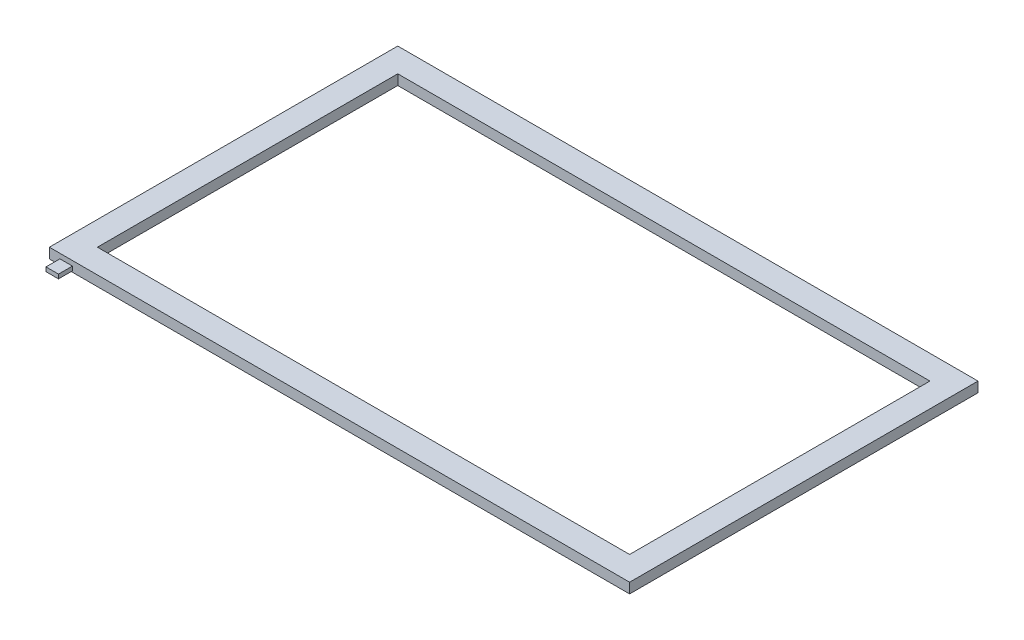
ISO-10303-21;
HEADER;
FILE_DESCRIPTION(('STEP AP214'),'2;1');
FILE_NAME('part.step','',(''),(''),'','','');
FILE_SCHEMA(('AUTOMOTIVE_DESIGN { 1 0 10303 214 1 1 1 1 }'));
ENDSEC;
DATA;
#1=APPLICATION_CONTEXT('core data for automotive mechanical design processes');
#2=APPLICATION_PROTOCOL_DEFINITION('international standard','automotive_design',2000,#1);
#3=PRODUCT_CONTEXT('',#1,'mechanical');
#4=PRODUCT('Part','Part','',(#3));
#5=PRODUCT_RELATED_PRODUCT_CATEGORY('part','',(#4));
#6=PRODUCT_DEFINITION_FORMATION('','',#4);
#7=PRODUCT_DEFINITION_CONTEXT('part definition',#1,'design');
#8=PRODUCT_DEFINITION('design','',#6,#7);
#9=PRODUCT_DEFINITION_SHAPE('','',#8);
#10=(LENGTH_UNIT() NAMED_UNIT(*) SI_UNIT(.MILLI.,.METRE.));
#11=(NAMED_UNIT(*) PLANE_ANGLE_UNIT() SI_UNIT($,.RADIAN.));
#12=(NAMED_UNIT(*) SI_UNIT($,.STERADIAN.) SOLID_ANGLE_UNIT());
#13=UNCERTAINTY_MEASURE_WITH_UNIT(LENGTH_MEASURE(1.E-05),#10,'distance_accuracy_value','');
#14=(GEOMETRIC_REPRESENTATION_CONTEXT(3) GLOBAL_UNCERTAINTY_ASSIGNED_CONTEXT((#13)) GLOBAL_UNIT_ASSIGNED_CONTEXT((#10,
#11,#12)) REPRESENTATION_CONTEXT('',''));
#15=CARTESIAN_POINT('',(0.,0.,0.));
#16=DIRECTION('',(0.,0.,1.));
#17=DIRECTION('',(1.,0.,0.));
#18=AXIS2_PLACEMENT_3D('',#15,#16,#17);
#19=CARTESIAN_POINT('',(383.38125,10.7950000000027,230.1875));
#20=DIRECTION('',(0.,0.,-1.));
#21=DIRECTION('',(1.,0.,0.));
#22=AXIS2_PLACEMENT_3D('',#19,#20,#21);
#23=PLANE('',#22);
#24=DIRECTION('',(-1.,0.,0.));
#25=VECTOR('',#24,1.);
#26=CARTESIAN_POINT('',(383.38125,24.2570000000027,230.1875));
#27=LINE('',#26,#25);
#28=CARTESIAN_POINT('',(383.38125,24.2570000000027,230.1875));
#29=VERTEX_POINT('',#28);
#30=CARTESIAN_POINT('',(-383.38125,24.2569999999973,230.1875));
#31=VERTEX_POINT('',#30);
#32=EDGE_CURVE('E185',#29,#31,#27,.T.);
#33=ORIENTED_EDGE('',*,*,#32,.T.);
#34=DIRECTION('',(0.,1.,0.));
#35=VECTOR('',#34,1.);
#36=CARTESIAN_POINT('',(-383.38125,10.7949999999973,230.1875));
#37=LINE('',#36,#35);
#38=CARTESIAN_POINT('',(-383.38125,10.7949999999973,230.1875));
#39=VERTEX_POINT('',#38);
#40=EDGE_CURVE('E191',#39,#31,#37,.T.);
#41=ORIENTED_EDGE('',*,*,#40,.F.);
#42=DIRECTION('',(-1.,0.,0.));
#43=VECTOR('',#42,1.);
#44=CARTESIAN_POINT('',(383.38125,10.7950000000027,230.1875));
#45=LINE('',#44,#43);
#46=CARTESIAN_POINT('',(383.38125,10.7950000000027,230.1875));
#47=VERTEX_POINT('',#46);
#48=EDGE_CURVE('E189',#47,#39,#45,.T.);
#49=ORIENTED_EDGE('',*,*,#48,.F.);
#50=DIRECTION('',(0.,1.,0.));
#51=VECTOR('',#50,1.);
#52=CARTESIAN_POINT('',(383.38125,10.7950000000027,230.1875));
#53=LINE('',#52,#51);
#54=EDGE_CURVE('E201',#47,#29,#53,.T.);
#55=ORIENTED_EDGE('',*,*,#54,.T.);
#56=EDGE_LOOP('',(#33,#41,#49,#55));
#57=FACE_BOUND('',#56,.T.);
#58=DIRECTION('',(0.,-1.,0.));
#59=VECTOR('',#58,1.);
#60=CARTESIAN_POINT('',(-369.41125,17.9069999999974,230.1875));
#61=LINE('',#60,#59);
#62=CARTESIAN_POINT('',(-369.41125,17.9069999999974,230.1875));
#63=VERTEX_POINT('',#62);
#64=CARTESIAN_POINT('',(-369.41125,12.3951999999974,230.1875));
#65=VERTEX_POINT('',#64);
#66=EDGE_CURVE('E142',#63,#65,#61,.T.);
#67=ORIENTED_EDGE('',*,*,#66,.F.);
#68=DIRECTION('',(-1.,0.,0.));
#69=VECTOR('',#68,1.);
#70=CARTESIAN_POINT('',(-369.41125,17.9069999999974,230.1875));
#71=LINE('',#70,#69);
#72=CARTESIAN_POINT('',(-352.90125,17.9069999999974,230.1875));
#73=VERTEX_POINT('',#72);
#74=EDGE_CURVE('E139',#73,#63,#71,.T.);
#75=ORIENTED_EDGE('',*,*,#74,.F.);
#76=DIRECTION('',(0.,1.,0.));
#77=VECTOR('',#76,1.);
#78=CARTESIAN_POINT('',(-352.90125,17.9069999999974,230.1875));
#79=LINE('',#78,#77);
#80=CARTESIAN_POINT('',(-352.90125,12.3951999999974,230.1875));
#81=VERTEX_POINT('',#80);
#82=EDGE_CURVE('E53',#81,#73,#79,.T.);
#83=ORIENTED_EDGE('',*,*,#82,.F.);
#84=DIRECTION('',(1.,0.,0.));
#85=VECTOR('',#84,1.);
#86=CARTESIAN_POINT('',(-369.41125,12.3951999999974,230.1875));
#87=LINE('',#86,#85);
#88=EDGE_CURVE('E48',#65,#81,#87,.T.);
#89=ORIENTED_EDGE('',*,*,#88,.F.);
#90=EDGE_LOOP('',(#67,#75,#83,#89));
#91=FACE_BOUND('',#90,.T.);
#92=ADVANCED_FACE('F33',(#57,#91),#23,.F.);
#93=CARTESIAN_POINT('',(-383.38125,10.7949999999973,230.1875));
#94=DIRECTION('',(1.,0.,0.));
#95=DIRECTION('',(0.,0.,1.));
#96=AXIS2_PLACEMENT_3D('',#93,#94,#95);
#97=PLANE('',#96);
#98=DIRECTION('',(0.,0.,-1.));
#99=VECTOR('',#98,1.);
#100=CARTESIAN_POINT('',(-383.38125,24.2569999999973,230.1875));
#101=LINE('',#100,#99);
#102=CARTESIAN_POINT('',(-383.38125,24.2569999999973,-230.1875));
#103=VERTEX_POINT('',#102);
#104=EDGE_CURVE('E174',#31,#103,#101,.T.);
#105=ORIENTED_EDGE('',*,*,#104,.T.);
#106=DIRECTION('',(0.,1.,0.));
#107=VECTOR('',#106,1.);
#108=CARTESIAN_POINT('',(-383.38125,10.7949999999973,-230.1875));
#109=LINE('',#108,#107);
#110=CARTESIAN_POINT('',(-383.38125,10.7949999999973,-230.1875));
#111=VERTEX_POINT('',#110);
#112=EDGE_CURVE('E11',#111,#103,#109,.T.);
#113=ORIENTED_EDGE('',*,*,#112,.F.);
#114=DIRECTION('',(0.,0.,-1.));
#115=VECTOR('',#114,1.);
#116=CARTESIAN_POINT('',(-383.38125,10.7949999999973,230.1875));
#117=LINE('',#116,#115);
#118=EDGE_CURVE('E181',#39,#111,#117,.T.);
#119=ORIENTED_EDGE('',*,*,#118,.F.);
#120=ORIENTED_EDGE('',*,*,#40,.T.);
#121=EDGE_LOOP('',(#105,#113,#119,#120));
#122=FACE_BOUND('',#121,.T.);
#123=ADVANCED_FACE('F35',(#122),#97,.F.);
#124=CARTESIAN_POINT('',(383.38125,10.7950000000027,-230.1875));
#125=DIRECTION('',(0.,0.,1.));
#126=DIRECTION('',(-1.,0.,0.));
#127=AXIS2_PLACEMENT_3D('',#124,#125,#126);
#128=PLANE('',#127);
#129=DIRECTION('',(1.,0.,0.));
#130=VECTOR('',#129,1.);
#131=CARTESIAN_POINT('',(383.38125,24.2570000000027,-230.1875));
#132=LINE('',#131,#130);
#133=CARTESIAN_POINT('',(383.38125,24.2570000000027,-230.1875));
#134=VERTEX_POINT('',#133);
#135=EDGE_CURVE('E194',#103,#134,#132,.T.);
#136=ORIENTED_EDGE('',*,*,#135,.T.);
#137=DIRECTION('',(0.,1.,0.));
#138=VECTOR('',#137,1.);
#139=CARTESIAN_POINT('',(383.38125,10.7950000000027,-230.1875));
#140=LINE('',#139,#138);
#141=CARTESIAN_POINT('',(383.38125,10.7950000000027,-230.1875));
#142=VERTEX_POINT('',#141);
#143=EDGE_CURVE('E41',#142,#134,#140,.T.);
#144=ORIENTED_EDGE('',*,*,#143,.F.);
#145=DIRECTION('',(1.,0.,0.));
#146=VECTOR('',#145,1.);
#147=CARTESIAN_POINT('',(383.38125,10.7950000000027,-230.1875));
#148=LINE('',#147,#146);
#149=EDGE_CURVE('E184',#111,#142,#148,.T.);
#150=ORIENTED_EDGE('',*,*,#149,.F.);
#151=ORIENTED_EDGE('',*,*,#112,.T.);
#152=EDGE_LOOP('',(#136,#144,#150,#151));
#153=FACE_BOUND('',#152,.T.);
#154=ADVANCED_FACE('F223',(#153),#128,.F.);
#155=CARTESIAN_POINT('',(383.38125,10.7950000000027,230.1875));
#156=DIRECTION('',(-1.,0.,0.));
#157=DIRECTION('',(0.,0.,-1.));
#158=AXIS2_PLACEMENT_3D('',#155,#156,#157);
#159=PLANE('',#158);
#160=DIRECTION('',(0.,0.,1.));
#161=VECTOR('',#160,1.);
#162=CARTESIAN_POINT('',(383.38125,24.2570000000027,230.1875));
#163=LINE('',#162,#161);
#164=EDGE_CURVE('E196',#134,#29,#163,.T.);
#165=ORIENTED_EDGE('',*,*,#164,.T.);
#166=ORIENTED_EDGE('',*,*,#54,.F.);
#167=DIRECTION('',(0.,0.,1.));
#168=VECTOR('',#167,1.);
#169=CARTESIAN_POINT('',(383.38125,10.7950000000027,230.1875));
#170=LINE('',#169,#168);
#171=EDGE_CURVE('E187',#142,#47,#170,.T.);
#172=ORIENTED_EDGE('',*,*,#171,.F.);
#173=ORIENTED_EDGE('',*,*,#143,.T.);
#174=EDGE_LOOP('',(#165,#166,#172,#173));
#175=FACE_BOUND('',#174,.T.);
#176=ADVANCED_FACE('F208',(#175),#159,.F.);
#177=CARTESIAN_POINT('',(2.63390369239648E-13,10.795,0.));
#178=DIRECTION('',(0.,1.,0.));
#179=DIRECTION('',(0.,0.,-1.));
#180=AXIS2_PLACEMENT_3D('',#177,#178,#179);
#181=PLANE('',#180);
#182=DIRECTION('',(1.,0.,0.));
#183=VECTOR('',#182,1.);
#184=CARTESIAN_POINT('',(351.63125,10.7950000000025,-198.4375));
#185=LINE('',#184,#183);
#186=CARTESIAN_POINT('',(-351.63125,10.7949999999975,-198.4375));
#187=VERTEX_POINT('',#186);
#188=CARTESIAN_POINT('',(351.63125,10.7950000000025,-198.4375));
#189=VERTEX_POINT('',#188);
#190=EDGE_CURVE('E145',#187,#189,#185,.T.);
#191=ORIENTED_EDGE('',*,*,#190,.F.);
#192=DIRECTION('',(0.,0.,-1.));
#193=VECTOR('',#192,1.);
#194=CARTESIAN_POINT('',(-351.63125,10.7949999999975,198.4375));
#195=LINE('',#194,#193);
#196=CARTESIAN_POINT('',(-351.63125,10.7949999999975,198.4375));
#197=VERTEX_POINT('',#196);
#198=EDGE_CURVE('E143',#197,#187,#195,.T.);
#199=ORIENTED_EDGE('',*,*,#198,.F.);
#200=DIRECTION('',(-1.,0.,0.));
#201=VECTOR('',#200,1.);
#202=CARTESIAN_POINT('',(351.63125,10.7950000000025,198.4375));
#203=LINE('',#202,#201);
#204=CARTESIAN_POINT('',(351.63125,10.7950000000025,198.4375));
#205=VERTEX_POINT('',#204);
#206=EDGE_CURVE('E155',#205,#197,#203,.T.);
#207=ORIENTED_EDGE('',*,*,#206,.F.);
#208=DIRECTION('',(0.,0.,1.));
#209=VECTOR('',#208,1.);
#210=CARTESIAN_POINT('',(351.63125,10.7950000000025,198.4375));
#211=LINE('',#210,#209);
#212=EDGE_CURVE('E167',#189,#205,#211,.T.);
#213=ORIENTED_EDGE('',*,*,#212,.F.);
#214=EDGE_LOOP('',(#191,#199,#207,#213));
#215=FACE_BOUND('',#214,.T.);
#216=ORIENTED_EDGE('',*,*,#118,.T.);
#217=ORIENTED_EDGE('',*,*,#149,.T.);
#218=ORIENTED_EDGE('',*,*,#171,.T.);
#219=ORIENTED_EDGE('',*,*,#48,.T.);
#220=EDGE_LOOP('',(#216,#217,#218,#219));
#221=FACE_BOUND('',#220,.T.);
#222=ADVANCED_FACE('F222',(#215,#221),#181,.F.);
#223=CARTESIAN_POINT('',(1.69385725672636E-13,24.257,0.));
#224=DIRECTION('',(0.,1.,0.));
#225=DIRECTION('',(0.,0.,-1.));
#226=AXIS2_PLACEMENT_3D('',#223,#224,#225);
#227=PLANE('',#226);
#228=DIRECTION('',(0.,0.,-1.));
#229=VECTOR('',#228,1.);
#230=CARTESIAN_POINT('',(-351.63125,24.2569999999975,198.4375));
#231=LINE('',#230,#229);
#232=CARTESIAN_POINT('',(-351.63125,24.2569999999975,198.4375));
#233=VERTEX_POINT('',#232);
#234=CARTESIAN_POINT('',(-351.63125,24.2569999999975,-198.4375));
#235=VERTEX_POINT('',#234);
#236=EDGE_CURVE('E151',#233,#235,#231,.T.);
#237=ORIENTED_EDGE('',*,*,#236,.T.);
#238=DIRECTION('',(1.,0.,0.));
#239=VECTOR('',#238,1.);
#240=CARTESIAN_POINT('',(351.63125,24.2570000000025,-198.4375));
#241=LINE('',#240,#239);
#242=CARTESIAN_POINT('',(351.63125,24.2570000000025,-198.4375));
#243=VERTEX_POINT('',#242);
#244=EDGE_CURVE('E154',#235,#243,#241,.T.);
#245=ORIENTED_EDGE('',*,*,#244,.T.);
#246=DIRECTION('',(0.,0.,1.));
#247=VECTOR('',#246,1.);
#248=CARTESIAN_POINT('',(351.63125,24.2570000000025,198.4375));
#249=LINE('',#248,#247);
#250=CARTESIAN_POINT('',(351.63125,24.2570000000025,198.4375));
#251=VERTEX_POINT('',#250);
#252=EDGE_CURVE('E158',#243,#251,#249,.T.);
#253=ORIENTED_EDGE('',*,*,#252,.T.);
#254=DIRECTION('',(-1.,0.,0.));
#255=VECTOR('',#254,1.);
#256=CARTESIAN_POINT('',(351.63125,24.2570000000025,198.4375));
#257=LINE('',#256,#255);
#258=EDGE_CURVE('E161',#251,#233,#257,.T.);
#259=ORIENTED_EDGE('',*,*,#258,.T.);
#260=EDGE_LOOP('',(#237,#245,#253,#259));
#261=FACE_BOUND('',#260,.T.);
#262=ORIENTED_EDGE('',*,*,#104,.F.);
#263=ORIENTED_EDGE('',*,*,#32,.F.);
#264=ORIENTED_EDGE('',*,*,#164,.F.);
#265=ORIENTED_EDGE('',*,*,#135,.F.);
#266=EDGE_LOOP('',(#262,#263,#264,#265));
#267=FACE_BOUND('',#266,.T.);
#268=ADVANCED_FACE('F214',(#261,#267),#227,.T.);
#269=CARTESIAN_POINT('',(-351.63125,24.2569999999975,198.4375));
#270=DIRECTION('',(-1.,0.,0.));
#271=DIRECTION('',(0.,0.,-1.));
#272=AXIS2_PLACEMENT_3D('',#269,#270,#271);
#273=PLANE('',#272);
#274=ORIENTED_EDGE('',*,*,#198,.T.);
#275=DIRECTION('',(0.,-1.,0.));
#276=VECTOR('',#275,1.);
#277=CARTESIAN_POINT('',(-351.63125,24.2569999999975,-198.4375));
#278=LINE('',#277,#276);
#279=EDGE_CURVE('E163',#235,#187,#278,.T.);
#280=ORIENTED_EDGE('',*,*,#279,.F.);
#281=ORIENTED_EDGE('',*,*,#236,.F.);
#282=DIRECTION('',(0.,-1.,0.));
#283=VECTOR('',#282,1.);
#284=CARTESIAN_POINT('',(-351.63125,24.2569999999975,198.4375));
#285=LINE('',#284,#283);
#286=EDGE_CURVE('E172',#233,#197,#285,.T.);
#287=ORIENTED_EDGE('',*,*,#286,.T.);
#288=EDGE_LOOP('',(#274,#280,#281,#287));
#289=FACE_BOUND('',#288,.T.);
#290=ADVANCED_FACE('F239',(#289),#273,.F.);
#291=CARTESIAN_POINT('',(351.63125,24.2570000000025,198.4375));
#292=DIRECTION('',(0.,0.,1.));
#293=DIRECTION('',(-1.,0.,0.));
#294=AXIS2_PLACEMENT_3D('',#291,#292,#293);
#295=PLANE('',#294);
#296=ORIENTED_EDGE('',*,*,#206,.T.);
#297=ORIENTED_EDGE('',*,*,#286,.F.);
#298=ORIENTED_EDGE('',*,*,#258,.F.);
#299=DIRECTION('',(0.,-1.,0.));
#300=VECTOR('',#299,1.);
#301=CARTESIAN_POINT('',(351.63125,24.2570000000025,198.4375));
#302=LINE('',#301,#300);
#303=EDGE_CURVE('E175',#251,#205,#302,.T.);
#304=ORIENTED_EDGE('',*,*,#303,.T.);
#305=EDGE_LOOP('',(#296,#297,#298,#304));
#306=FACE_BOUND('',#305,.T.);
#307=ADVANCED_FACE('F246',(#306),#295,.F.);
#308=CARTESIAN_POINT('',(351.63125,24.2570000000025,198.4375));
#309=DIRECTION('',(1.,0.,0.));
#310=DIRECTION('',(0.,0.,1.));
#311=AXIS2_PLACEMENT_3D('',#308,#309,#310);
#312=PLANE('',#311);
#313=ORIENTED_EDGE('',*,*,#212,.T.);
#314=ORIENTED_EDGE('',*,*,#303,.F.);
#315=ORIENTED_EDGE('',*,*,#252,.F.);
#316=DIRECTION('',(0.,-1.,0.));
#317=VECTOR('',#316,1.);
#318=CARTESIAN_POINT('',(351.63125,24.2570000000025,-198.4375));
#319=LINE('',#318,#317);
#320=EDGE_CURVE('E177',#243,#189,#319,.T.);
#321=ORIENTED_EDGE('',*,*,#320,.T.);
#322=EDGE_LOOP('',(#313,#314,#315,#321));
#323=FACE_BOUND('',#322,.T.);
#324=ADVANCED_FACE('F251',(#323),#312,.F.);
#325=CARTESIAN_POINT('',(351.63125,24.2570000000025,-198.4375));
#326=DIRECTION('',(0.,0.,-1.));
#327=DIRECTION('',(1.,0.,0.));
#328=AXIS2_PLACEMENT_3D('',#325,#326,#327);
#329=PLANE('',#328);
#330=ORIENTED_EDGE('',*,*,#190,.T.);
#331=ORIENTED_EDGE('',*,*,#320,.F.);
#332=ORIENTED_EDGE('',*,*,#244,.F.);
#333=ORIENTED_EDGE('',*,*,#279,.T.);
#334=EDGE_LOOP('',(#330,#331,#332,#333));
#335=FACE_BOUND('',#334,.T.);
#336=ADVANCED_FACE('F248',(#335),#329,.F.);
#337=CARTESIAN_POINT('',(-369.41125,17.9069999999974,248.6025));
#338=DIRECTION('',(1.,0.,0.));
#339=DIRECTION('',(0.,0.,-1.));
#340=AXIS2_PLACEMENT_3D('',#337,#338,#339);
#341=PLANE('',#340);
#342=ORIENTED_EDGE('',*,*,#66,.T.);
#343=DIRECTION('',(0.,0.,-1.));
#344=VECTOR('',#343,1.);
#345=CARTESIAN_POINT('',(-369.41125,12.3951999999974,248.6025));
#346=LINE('',#345,#344);
#347=CARTESIAN_POINT('',(-369.41125,12.3951999999974,248.6025));
#348=VERTEX_POINT('',#347);
#349=EDGE_CURVE('E123',#348,#65,#346,.T.);
#350=ORIENTED_EDGE('',*,*,#349,.F.);
#351=DIRECTION('',(0.,-1.,0.));
#352=VECTOR('',#351,1.);
#353=CARTESIAN_POINT('',(-369.41125,17.9069999999974,248.6025));
#354=LINE('',#353,#352);
#355=CARTESIAN_POINT('',(-369.41125,17.9069999999974,248.6025));
#356=VERTEX_POINT('',#355);
#357=EDGE_CURVE('E130',#356,#348,#354,.T.);
#358=ORIENTED_EDGE('',*,*,#357,.F.);
#359=DIRECTION('',(0.,0.,-1.));
#360=VECTOR('',#359,1.);
#361=CARTESIAN_POINT('',(-369.41125,17.9069999999974,248.6025));
#362=LINE('',#361,#360);
#363=EDGE_CURVE('E358',#356,#63,#362,.T.);
#364=ORIENTED_EDGE('',*,*,#363,.T.);
#365=EDGE_LOOP('',(#342,#350,#358,#364));
#366=FACE_BOUND('',#365,.T.);
#367=ADVANCED_FACE('F141',(#366),#341,.F.);
#368=CARTESIAN_POINT('',(-369.41125,12.3951999999974,248.6025));
#369=DIRECTION('',(0.,1.,0.));
#370=DIRECTION('',(0.,0.,1.));
#371=AXIS2_PLACEMENT_3D('',#368,#369,#370);
#372=PLANE('',#371);
#373=ORIENTED_EDGE('',*,*,#88,.T.);
#374=DIRECTION('',(0.,0.,-1.));
#375=VECTOR('',#374,1.);
#376=CARTESIAN_POINT('',(-352.90125,12.3951999999974,248.6025));
#377=LINE('',#376,#375);
#378=CARTESIAN_POINT('',(-352.90125,12.3951999999974,248.6025));
#379=VERTEX_POINT('',#378);
#380=EDGE_CURVE('E126',#379,#81,#377,.T.);
#381=ORIENTED_EDGE('',*,*,#380,.F.);
#382=DIRECTION('',(1.,0.,0.));
#383=VECTOR('',#382,1.);
#384=CARTESIAN_POINT('',(-369.41125,12.3951999999974,248.6025));
#385=LINE('',#384,#383);
#386=EDGE_CURVE('E119',#348,#379,#385,.T.);
#387=ORIENTED_EDGE('',*,*,#386,.F.);
#388=ORIENTED_EDGE('',*,*,#349,.T.);
#389=EDGE_LOOP('',(#373,#381,#387,#388));
#390=FACE_BOUND('',#389,.T.);
#391=ADVANCED_FACE('F121',(#390),#372,.F.);
#392=CARTESIAN_POINT('',(-352.90125,17.9069999999974,248.6025));
#393=DIRECTION('',(-1.,0.,0.));
#394=DIRECTION('',(0.,0.,1.));
#395=AXIS2_PLACEMENT_3D('',#392,#393,#394);
#396=PLANE('',#395);
#397=ORIENTED_EDGE('',*,*,#82,.T.);
#398=DIRECTION('',(0.,0.,-1.));
#399=VECTOR('',#398,1.);
#400=CARTESIAN_POINT('',(-352.90125,17.9069999999974,248.6025));
#401=LINE('',#400,#399);
#402=CARTESIAN_POINT('',(-352.90125,17.9069999999974,248.6025));
#403=VERTEX_POINT('',#402);
#404=EDGE_CURVE('E147',#403,#73,#401,.T.);
#405=ORIENTED_EDGE('',*,*,#404,.F.);
#406=DIRECTION('',(0.,1.,0.));
#407=VECTOR('',#406,1.);
#408=CARTESIAN_POINT('',(-352.90125,17.9069999999974,248.6025));
#409=LINE('',#408,#407);
#410=EDGE_CURVE('E129',#379,#403,#409,.T.);
#411=ORIENTED_EDGE('',*,*,#410,.F.);
#412=ORIENTED_EDGE('',*,*,#380,.T.);
#413=EDGE_LOOP('',(#397,#405,#411,#412));
#414=FACE_BOUND('',#413,.T.);
#415=ADVANCED_FACE('F263',(#414),#396,.F.);
#416=CARTESIAN_POINT('',(-369.41125,17.9069999999974,248.6025));
#417=DIRECTION('',(0.,-1.,0.));
#418=DIRECTION('',(0.,0.,-1.));
#419=AXIS2_PLACEMENT_3D('',#416,#417,#418);
#420=PLANE('',#419);
#421=ORIENTED_EDGE('',*,*,#74,.T.);
#422=ORIENTED_EDGE('',*,*,#363,.F.);
#423=DIRECTION('',(-1.,0.,0.));
#424=VECTOR('',#423,1.);
#425=CARTESIAN_POINT('',(-369.41125,17.9069999999974,248.6025));
#426=LINE('',#425,#424);
#427=EDGE_CURVE('E135',#403,#356,#426,.T.);
#428=ORIENTED_EDGE('',*,*,#427,.F.);
#429=ORIENTED_EDGE('',*,*,#404,.T.);
#430=EDGE_LOOP('',(#421,#422,#428,#429));
#431=FACE_BOUND('',#430,.T.);
#432=ADVANCED_FACE('F266',(#431),#420,.F.);
#433=CARTESIAN_POINT('',(0.,0.,248.6025));
#434=DIRECTION('',(0.,0.,1.));
#435=DIRECTION('',(1.,0.,0.));
#436=AXIS2_PLACEMENT_3D('',#433,#434,#435);
#437=PLANE('',#436);
#438=ORIENTED_EDGE('',*,*,#357,.T.);
#439=ORIENTED_EDGE('',*,*,#386,.T.);
#440=ORIENTED_EDGE('',*,*,#410,.T.);
#441=ORIENTED_EDGE('',*,*,#427,.T.);
#442=EDGE_LOOP('',(#438,#439,#440,#441));
#443=FACE_BOUND('',#442,.T.);
#444=ADVANCED_FACE('F133',(#443),#437,.T.);
#445=CLOSED_SHELL('',(#92,#123,#154,#176,#222,#268,#290,#307,#324,#336,#367,#391,#415,#432,#444));
#446=MANIFOLD_SOLID_BREP('B2',#445);
#447=ADVANCED_BREP_SHAPE_REPRESENTATION('',(#18,#446),#14);
#448=SHAPE_DEFINITION_REPRESENTATION(#9,#447);
ENDSEC;
END-ISO-10303-21;
